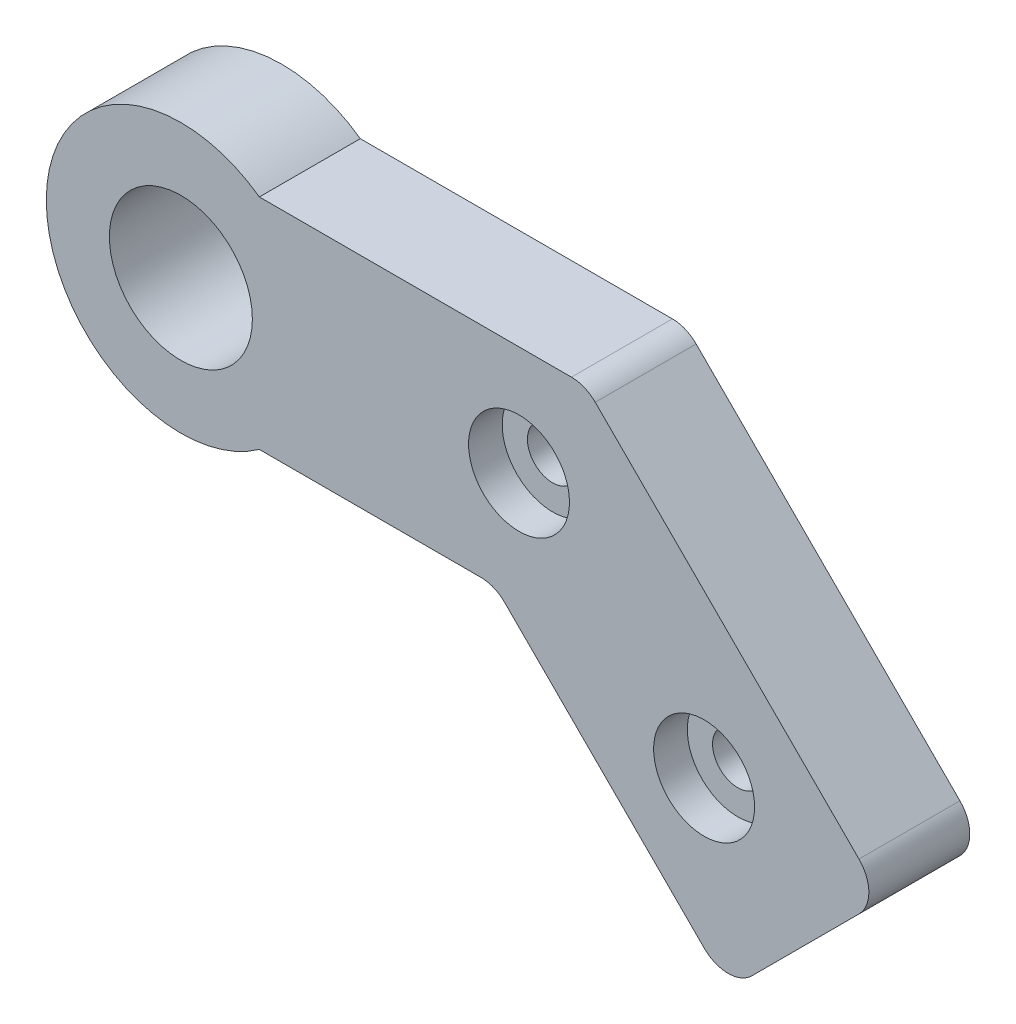
ISO-10303-21;
HEADER;
FILE_DESCRIPTION(('STEP AP214'),'2;1');
FILE_NAME('part.step','',(''),(''),'','','');
FILE_SCHEMA(('AUTOMOTIVE_DESIGN { 1 0 10303 214 1 1 1 1 }'));
ENDSEC;
DATA;
#1=APPLICATION_CONTEXT('core data for automotive mechanical design processes');
#2=APPLICATION_PROTOCOL_DEFINITION('international standard','automotive_design',2000,#1);
#3=PRODUCT_CONTEXT('',#1,'mechanical');
#4=PRODUCT('Part','Part','',(#3));
#5=PRODUCT_RELATED_PRODUCT_CATEGORY('part','',(#4));
#6=PRODUCT_DEFINITION_FORMATION('','',#4);
#7=PRODUCT_DEFINITION_CONTEXT('part definition',#1,'design');
#8=PRODUCT_DEFINITION('design','',#6,#7);
#9=PRODUCT_DEFINITION_SHAPE('','',#8);
#10=(LENGTH_UNIT() NAMED_UNIT(*) SI_UNIT(.MILLI.,.METRE.));
#11=(NAMED_UNIT(*) PLANE_ANGLE_UNIT() SI_UNIT($,.RADIAN.));
#12=(NAMED_UNIT(*) SI_UNIT($,.STERADIAN.) SOLID_ANGLE_UNIT());
#13=UNCERTAINTY_MEASURE_WITH_UNIT(LENGTH_MEASURE(1.E-05),#10,'distance_accuracy_value','');
#14=(GEOMETRIC_REPRESENTATION_CONTEXT(3) GLOBAL_UNCERTAINTY_ASSIGNED_CONTEXT((#13)) GLOBAL_UNIT_ASSIGNED_CONTEXT((#10,
#11,#12)) REPRESENTATION_CONTEXT('',''));
#15=CARTESIAN_POINT('',(0.,0.,0.));
#16=DIRECTION('',(0.,0.,1.));
#17=DIRECTION('',(1.,0.,0.));
#18=AXIS2_PLACEMENT_3D('',#15,#16,#17);
#19=CARTESIAN_POINT('',(14.2359098755599,-9.17285726228399,0.));
#20=DIRECTION('',(0.,0.,1.));
#21=DIRECTION('',(1.,0.,0.));
#22=AXIS2_PLACEMENT_3D('',#19,#20,#21);
#23=CYLINDRICAL_SURFACE('',#22,1.49999999999999);
#24=CARTESIAN_POINT('',(14.2359098755599,-9.17285726228399,0.));
#25=DIRECTION('',(0.,0.,1.));
#26=DIRECTION('',(1.,0.,0.));
#27=AXIS2_PLACEMENT_3D('',#24,#25,#26);
#28=CIRCLE('',#27,1.49999999999999);
#29=CARTESIAN_POINT('',(15.7359098755599,-9.17285726228399,0.));
#30=VERTEX_POINT('',#29);
#31=EDGE_CURVE('E177',#30,#30,#28,.T.);
#32=ORIENTED_EDGE('',*,*,#31,.F.);
#33=EDGE_LOOP('',(#32));
#34=FACE_BOUND('',#33,.T.);
#35=CARTESIAN_POINT('',(14.2359098755599,-9.17285726228399,4.));
#36=DIRECTION('',(0.,0.,1.));
#37=DIRECTION('',(1.,0.,0.));
#38=AXIS2_PLACEMENT_3D('',#35,#36,#37);
#39=CIRCLE('',#38,1.49999999999999);
#40=CARTESIAN_POINT('',(15.7359098755599,-9.17285726228399,4.));
#41=VERTEX_POINT('',#40);
#42=EDGE_CURVE('E39',#41,#41,#39,.F.);
#43=ORIENTED_EDGE('',*,*,#42,.F.);
#44=EDGE_LOOP('',(#43));
#45=FACE_BOUND('',#44,.T.);
#46=ADVANCED_FACE('F35',(#34,#45),#23,.F.);
#47=CARTESIAN_POINT('',(3.23195226079932,1.02091126621189,0.));
#48=DIRECTION('',(0.,0.,1.));
#49=DIRECTION('',(1.,0.,0.));
#50=AXIS2_PLACEMENT_3D('',#47,#48,#49);
#51=CYLINDRICAL_SURFACE('',#50,1.5);
#52=CARTESIAN_POINT('',(3.23195226079932,1.02091126621189,0.));
#53=DIRECTION('',(0.,0.,1.));
#54=DIRECTION('',(1.,0.,0.));
#55=AXIS2_PLACEMENT_3D('',#52,#53,#54);
#56=CIRCLE('',#55,1.5);
#57=CARTESIAN_POINT('',(4.73195226079932,1.02091126621189,0.));
#58=VERTEX_POINT('',#57);
#59=EDGE_CURVE('E182',#58,#58,#56,.T.);
#60=ORIENTED_EDGE('',*,*,#59,.F.);
#61=EDGE_LOOP('',(#60));
#62=FACE_BOUND('',#61,.T.);
#63=CARTESIAN_POINT('',(3.23195226079932,1.02091126621189,4.));
#64=DIRECTION('',(0.,0.,1.));
#65=DIRECTION('',(1.,0.,0.));
#66=AXIS2_PLACEMENT_3D('',#63,#64,#65);
#67=CIRCLE('',#66,1.5);
#68=CARTESIAN_POINT('',(4.73195226079932,1.02091126621189,4.));
#69=VERTEX_POINT('',#68);
#70=EDGE_CURVE('E175',#69,#69,#67,.F.);
#71=ORIENTED_EDGE('',*,*,#70,.F.);
#72=EDGE_LOOP('',(#71));
#73=FACE_BOUND('',#72,.T.);
#74=ADVANCED_FACE('F259',(#62,#73),#51,.F.);
#75=CARTESIAN_POINT('',(-16.8680476661656,1.02262474517077,6.));
#76=DIRECTION('',(0.,0.,-1.));
#77=DIRECTION('',(-1.,0.,0.));
#78=AXIS2_PLACEMENT_3D('',#75,#76,#77);
#79=CYLINDRICAL_SURFACE('',#78,7.99999999999991);
#80=CARTESIAN_POINT('',(-16.8680476661656,1.02262474517077,0.));
#81=DIRECTION('',(0.,0.,1.));
#82=DIRECTION('',(1.,0.,0.));
#83=AXIS2_PLACEMENT_3D('',#80,#81,#82);
#84=CIRCLE('',#83,7.99999999999991);
#85=CARTESIAN_POINT('',(-12.2019709104262,7.52091126621188,0.));
#86=VERTEX_POINT('',#85);
#87=CARTESIAN_POINT('',(-12.2067472212763,-5.47908873378811,0.));
#88=VERTEX_POINT('',#87);
#89=EDGE_CURVE('E140',#86,#88,#84,.T.);
#90=ORIENTED_EDGE('',*,*,#89,.T.);
#91=DIRECTION('',(0.,0.,-1.));
#92=VECTOR('',#91,1.);
#93=CARTESIAN_POINT('',(-12.2067472212763,-5.47908873378811,6.));
#94=LINE('',#93,#92);
#95=CARTESIAN_POINT('',(-12.2067472212763,-5.47908873378811,6.));
#96=VERTEX_POINT('',#95);
#97=EDGE_CURVE('E121',#96,#88,#94,.T.);
#98=ORIENTED_EDGE('',*,*,#97,.F.);
#99=CARTESIAN_POINT('',(-16.8680476661656,1.02262474517077,6.));
#100=DIRECTION('',(0.,0.,1.));
#101=DIRECTION('',(1.,0.,0.));
#102=AXIS2_PLACEMENT_3D('',#99,#100,#101);
#103=CIRCLE('',#102,7.99999999999991);
#104=CARTESIAN_POINT('',(-12.2019709104262,7.52091126621188,6.));
#105=VERTEX_POINT('',#104);
#106=EDGE_CURVE('E127',#105,#96,#103,.T.);
#107=ORIENTED_EDGE('',*,*,#106,.F.);
#108=DIRECTION('',(0.,0.,-1.));
#109=VECTOR('',#108,1.);
#110=CARTESIAN_POINT('',(-12.2019709104262,7.52091126621188,6.));
#111=LINE('',#110,#109);
#112=EDGE_CURVE('E142',#105,#86,#111,.T.);
#113=ORIENTED_EDGE('',*,*,#112,.T.);
#114=EDGE_LOOP('',(#90,#98,#107,#113));
#115=FACE_BOUND('',#114,.T.);
#116=ADVANCED_FACE('F138',(#115),#79,.T.);
#117=CARTESIAN_POINT('',(-12.2067472212763,-5.47908873378811,6.));
#118=DIRECTION('',(0.,1.,0.));
#119=DIRECTION('',(-1.,0.,0.));
#120=AXIS2_PLACEMENT_3D('',#117,#118,#119);
#121=PLANE('',#120);
#122=DIRECTION('',(1.,0.,0.));
#123=VECTOR('',#122,1.);
#124=CARTESIAN_POINT('',(-12.2067472212763,-5.47908873378811,0.));
#125=LINE('',#124,#123);
#126=CARTESIAN_POINT('',(0.964825653977482,-5.47908873378811,0.));
#127=VERTEX_POINT('',#126);
#128=EDGE_CURVE('E210',#88,#127,#125,.T.);
#129=ORIENTED_EDGE('',*,*,#128,.T.);
#130=DIRECTION('',(0.,0.,-1.));
#131=VECTOR('',#130,1.);
#132=CARTESIAN_POINT('',(0.964825653977483,-5.47908873378811,6.));
#133=LINE('',#132,#131);
#134=CARTESIAN_POINT('',(0.964825653977482,-5.47908873378811,6.));
#135=VERTEX_POINT('',#134);
#136=EDGE_CURVE('E124',#127,#135,#133,.F.);
#137=ORIENTED_EDGE('',*,*,#136,.T.);
#138=DIRECTION('',(1.,0.,0.));
#139=VECTOR('',#138,1.);
#140=CARTESIAN_POINT('',(-12.2067472212763,-5.47908873378811,6.));
#141=LINE('',#140,#139);
#142=EDGE_CURVE('E116',#96,#135,#141,.T.);
#143=ORIENTED_EDGE('',*,*,#142,.F.);
#144=ORIENTED_EDGE('',*,*,#97,.T.);
#145=EDGE_LOOP('',(#129,#137,#143,#144));
#146=FACE_BOUND('',#145,.T.);
#147=ADVANCED_FACE('F119',(#146),#121,.F.);
#148=CARTESIAN_POINT('',(1.79325277872366,-5.47908873378811,6.));
#149=DIRECTION('',(0.707106781186541,0.707106781186553,0.));
#150=DIRECTION('',(-0.707106781186554,0.707106781186542,0.));
#151=AXIS2_PLACEMENT_3D('',#148,#149,#150);
#152=PLANE('',#151);
#153=DIRECTION('',(0.707106781186554,-0.707106781186541,0.));
#154=VECTOR('',#153,1.);
#155=CARTESIAN_POINT('',(1.79325277872366,-5.47908873378811,0.));
#156=LINE('',#155,#154);
#157=CARTESIAN_POINT('',(2.37903921635057,-6.06487517141501,0.));
#158=VERTEX_POINT('',#157);
#159=CARTESIAN_POINT('',(14.2490969014395,-17.9349328565038,0.));
#160=VERTEX_POINT('',#159);
#161=EDGE_CURVE('E212',#158,#160,#156,.T.);
#162=ORIENTED_EDGE('',*,*,#161,.T.);
#163=DIRECTION('',(0.,0.,-1.));
#164=VECTOR('',#163,1.);
#165=CARTESIAN_POINT('',(14.2490969014395,-17.9349328565038,6.));
#166=LINE('',#165,#164);
#167=CARTESIAN_POINT('',(14.2490969014395,-17.9349328565038,6.));
#168=VERTEX_POINT('',#167);
#169=EDGE_CURVE('E60',#160,#168,#166,.F.);
#170=ORIENTED_EDGE('',*,*,#169,.T.);
#171=DIRECTION('',(0.707106781186554,-0.707106781186541,0.));
#172=VECTOR('',#171,1.);
#173=CARTESIAN_POINT('',(1.79325277872366,-5.47908873378811,6.));
#174=LINE('',#173,#172);
#175=CARTESIAN_POINT('',(2.37903921635057,-6.06487517141501,6.));
#176=VERTEX_POINT('',#175);
#177=EDGE_CURVE('E126',#176,#168,#174,.T.);
#178=ORIENTED_EDGE('',*,*,#177,.F.);
#179=DIRECTION('',(0.,0.,-1.));
#180=VECTOR('',#179,1.);
#181=CARTESIAN_POINT('',(2.37903921635057,-6.06487517141501,0.));
#182=LINE('',#181,#180);
#183=EDGE_CURVE('E167',#176,#158,#182,.T.);
#184=ORIENTED_EDGE('',*,*,#183,.T.);
#185=EDGE_LOOP('',(#162,#170,#178,#184));
#186=FACE_BOUND('',#185,.T.);
#187=ADVANCED_FACE('F231',(#186),#152,.F.);
#188=CARTESIAN_POINT('',(24.8556986192377,-10.1567582634517,6.));
#189=DIRECTION('',(-0.707106781186553,0.707106781186541,0.));
#190=DIRECTION('',(-0.707106781186542,-0.707106781186554,0.));
#191=AXIS2_PLACEMENT_3D('',#188,#189,#190);
#192=PLANE('',#191);
#193=DIRECTION('',(0.707106781186541,0.707106781186554,0.));
#194=VECTOR('',#193,1.);
#195=CARTESIAN_POINT('',(24.8556986192377,-10.1567582634517,0.));
#196=LINE('',#195,#194);
#197=CARTESIAN_POINT('',(17.0775240261857,-17.9349328565037,0.));
#198=VERTEX_POINT('',#197);
#199=CARTESIAN_POINT('',(23.4414850568646,-11.5709718258248,0.));
#200=VERTEX_POINT('',#199);
#201=EDGE_CURVE('E214',#198,#200,#196,.T.);
#202=ORIENTED_EDGE('',*,*,#201,.T.);
#203=DIRECTION('',(0.,0.,-1.));
#204=VECTOR('',#203,1.);
#205=CARTESIAN_POINT('',(23.4414850568646,-11.5709718258248,6.));
#206=LINE('',#205,#204);
#207=CARTESIAN_POINT('',(23.4414850568646,-11.5709718258248,6.));
#208=VERTEX_POINT('',#207);
#209=EDGE_CURVE('E160',#200,#208,#206,.F.);
#210=ORIENTED_EDGE('',*,*,#209,.T.);
#211=DIRECTION('',(0.707106781186541,0.707106781186554,0.));
#212=VECTOR('',#211,1.);
#213=CARTESIAN_POINT('',(24.8556986192377,-10.1567582634517,6.));
#214=LINE('',#213,#212);
#215=CARTESIAN_POINT('',(17.0775240261857,-17.9349328565037,6.));
#216=VERTEX_POINT('',#215);
#217=EDGE_CURVE('E204',#216,#208,#214,.T.);
#218=ORIENTED_EDGE('',*,*,#217,.F.);
#219=DIRECTION('',(0.,0.,-1.));
#220=VECTOR('',#219,1.);
#221=CARTESIAN_POINT('',(17.0775240261857,-17.9349328565037,6.));
#222=LINE('',#221,#220);
#223=EDGE_CURVE('E157',#216,#198,#222,.T.);
#224=ORIENTED_EDGE('',*,*,#223,.T.);
#225=EDGE_LOOP('',(#202,#210,#218,#224));
#226=FACE_BOUND('',#225,.T.);
#227=ADVANCED_FACE('F238',(#226),#192,.F.);
#228=CARTESIAN_POINT('',(7.17802908957383,7.52091126621189,6.));
#229=DIRECTION('',(-0.707106781186541,-0.707106781186554,0.));
#230=DIRECTION('',(0.707106781186554,-0.707106781186541,0.));
#231=AXIS2_PLACEMENT_3D('',#228,#229,#230);
#232=PLANE('',#231);
#233=DIRECTION('',(-0.707106781186554,0.707106781186541,0.));
#234=VECTOR('',#233,1.);
#235=CARTESIAN_POINT('',(7.17802908957383,7.52091126621189,6.));
#236=LINE('',#235,#234);
#237=CARTESIAN_POINT('',(23.4414850568646,-8.74254470107858,6.));
#238=VERTEX_POINT('',#237);
#239=CARTESIAN_POINT('',(7.76381552720074,6.93512482858499,6.));
#240=VERTEX_POINT('',#239);
#241=EDGE_CURVE('E206',#238,#240,#236,.T.);
#242=ORIENTED_EDGE('',*,*,#241,.F.);
#243=DIRECTION('',(0.,0.,-1.));
#244=VECTOR('',#243,1.);
#245=CARTESIAN_POINT('',(23.4414850568646,-8.74254470107857,6.));
#246=LINE('',#245,#244);
#247=CARTESIAN_POINT('',(23.4414850568646,-8.74254470107858,0.));
#248=VERTEX_POINT('',#247);
#249=EDGE_CURVE('E144',#238,#248,#246,.T.);
#250=ORIENTED_EDGE('',*,*,#249,.T.);
#251=DIRECTION('',(-0.707106781186554,0.707106781186541,0.));
#252=VECTOR('',#251,1.);
#253=CARTESIAN_POINT('',(7.17802908957383,7.52091126621189,0.));
#254=LINE('',#253,#252);
#255=CARTESIAN_POINT('',(7.76381552720074,6.93512482858499,0.));
#256=VERTEX_POINT('',#255);
#257=EDGE_CURVE('E217',#248,#256,#254,.T.);
#258=ORIENTED_EDGE('',*,*,#257,.T.);
#259=DIRECTION('',(0.,0.,-1.));
#260=VECTOR('',#259,1.);
#261=CARTESIAN_POINT('',(7.76381552720074,6.93512482858499,6.));
#262=LINE('',#261,#260);
#263=EDGE_CURVE('E141',#256,#240,#262,.F.);
#264=ORIENTED_EDGE('',*,*,#263,.T.);
#265=EDGE_LOOP('',(#242,#250,#258,#264));
#266=FACE_BOUND('',#265,.T.);
#267=ADVANCED_FACE('F246',(#266),#232,.F.);
#268=CARTESIAN_POINT('',(-12.2019709104262,7.52091126621188,6.));
#269=DIRECTION('',(0.,-1.,0.));
#270=DIRECTION('',(1.,0.,0.));
#271=AXIS2_PLACEMENT_3D('',#268,#269,#270);
#272=PLANE('',#271);
#273=DIRECTION('',(-1.,0.,0.));
#274=VECTOR('',#273,1.);
#275=CARTESIAN_POINT('',(-12.2019709104262,7.52091126621188,6.));
#276=LINE('',#275,#274);
#277=CARTESIAN_POINT('',(6.34960196482765,7.52091126621189,6.));
#278=VERTEX_POINT('',#277);
#279=EDGE_CURVE('E132',#278,#105,#276,.T.);
#280=ORIENTED_EDGE('',*,*,#279,.F.);
#281=DIRECTION('',(0.,0.,-1.));
#282=VECTOR('',#281,1.);
#283=CARTESIAN_POINT('',(6.34960196482765,7.52091126621189,6.));
#284=LINE('',#283,#282);
#285=CARTESIAN_POINT('',(6.34960196482765,7.52091126621189,0.));
#286=VERTEX_POINT('',#285);
#287=EDGE_CURVE('E172',#278,#286,#284,.T.);
#288=ORIENTED_EDGE('',*,*,#287,.T.);
#289=DIRECTION('',(-1.,0.,0.));
#290=VECTOR('',#289,1.);
#291=CARTESIAN_POINT('',(-12.2019709104262,7.52091126621188,0.));
#292=LINE('',#291,#290);
#293=EDGE_CURVE('E136',#286,#86,#292,.T.);
#294=ORIENTED_EDGE('',*,*,#293,.T.);
#295=ORIENTED_EDGE('',*,*,#112,.F.);
#296=EDGE_LOOP('',(#280,#288,#294,#295));
#297=FACE_BOUND('',#296,.T.);
#298=ADVANCED_FACE('F221',(#297),#272,.F.);
#299=CARTESIAN_POINT('',(-16.8680476661656,1.02262474517077,6.));
#300=DIRECTION('',(0.,0.,1.));
#301=DIRECTION('',(1.,0.,0.));
#302=AXIS2_PLACEMENT_3D('',#299,#300,#301);
#303=PLANE('',#302);
#304=CARTESIAN_POINT('',(14.2359098755599,-9.17285726228399,6.));
#305=DIRECTION('',(0.,0.,1.));
#306=DIRECTION('',(1.,0.,0.));
#307=AXIS2_PLACEMENT_3D('',#304,#305,#306);
#308=CIRCLE('',#307,3.);
#309=CARTESIAN_POINT('',(17.2359098755599,-9.17285726228399,6.));
#310=VERTEX_POINT('',#309);
#311=EDGE_CURVE('E192',#310,#310,#308,.T.);
#312=ORIENTED_EDGE('',*,*,#311,.F.);
#313=EDGE_LOOP('',(#312));
#314=FACE_BOUND('',#313,.T.);
#315=CARTESIAN_POINT('',(3.23195226079932,1.02091126621189,6.));
#316=DIRECTION('',(0.,0.,1.));
#317=DIRECTION('',(1.,0.,0.));
#318=AXIS2_PLACEMENT_3D('',#315,#316,#317);
#319=CIRCLE('',#318,3.);
#320=CARTESIAN_POINT('',(6.23195226079932,1.02091126621189,6.));
#321=VERTEX_POINT('',#320);
#322=EDGE_CURVE('E185',#321,#321,#319,.T.);
#323=ORIENTED_EDGE('',*,*,#322,.F.);
#324=EDGE_LOOP('',(#323));
#325=FACE_BOUND('',#324,.T.);
#326=CARTESIAN_POINT('',(-16.8680476661656,1.02262474517077,6.));
#327=DIRECTION('',(0.,0.,1.));
#328=DIRECTION('',(1.,0.,0.));
#329=AXIS2_PLACEMENT_3D('',#326,#327,#328);
#330=CIRCLE('',#329,4.25);
#331=CARTESIAN_POINT('',(-12.6180476661656,1.02262474517077,6.));
#332=VERTEX_POINT('',#331);
#333=EDGE_CURVE('E197',#332,#332,#330,.T.);
#334=ORIENTED_EDGE('',*,*,#333,.F.);
#335=EDGE_LOOP('',(#334));
#336=FACE_BOUND('',#335,.T.);
#337=ORIENTED_EDGE('',*,*,#217,.T.);
#338=CARTESIAN_POINT('',(22.0272714944915,-10.1567582634517,6.));
#339=DIRECTION('',(0.,0.,1.));
#340=DIRECTION('',(1.,0.,0.));
#341=AXIS2_PLACEMENT_3D('',#338,#339,#340);
#342=CIRCLE('',#341,2.);
#343=EDGE_CURVE('E165',#208,#238,#342,.T.);
#344=ORIENTED_EDGE('',*,*,#343,.T.);
#345=ORIENTED_EDGE('',*,*,#241,.T.);
#346=CARTESIAN_POINT('',(6.34960196482765,5.52091126621188,6.));
#347=DIRECTION('',(0.,0.,1.));
#348=DIRECTION('',(1.,0.,0.));
#349=AXIS2_PLACEMENT_3D('',#346,#347,#348);
#350=CIRCLE('',#349,2.);
#351=EDGE_CURVE('E52',#240,#278,#350,.T.);
#352=ORIENTED_EDGE('',*,*,#351,.T.);
#353=ORIENTED_EDGE('',*,*,#279,.T.);
#354=ORIENTED_EDGE('',*,*,#106,.T.);
#355=ORIENTED_EDGE('',*,*,#142,.T.);
#356=CARTESIAN_POINT('',(0.964825653977483,-7.47908873378811,6.));
#357=DIRECTION('',(0.,0.,1.));
#358=DIRECTION('',(1.,0.,0.));
#359=AXIS2_PLACEMENT_3D('',#356,#357,#358);
#360=CIRCLE('',#359,2.);
#361=EDGE_CURVE('E11',#135,#176,#360,.F.);
#362=ORIENTED_EDGE('',*,*,#361,.T.);
#363=ORIENTED_EDGE('',*,*,#177,.T.);
#364=CARTESIAN_POINT('',(15.6633104638126,-16.5207192941307,6.));
#365=DIRECTION('',(0.,0.,1.));
#366=DIRECTION('',(1.,0.,0.));
#367=AXIS2_PLACEMENT_3D('',#364,#365,#366);
#368=CIRCLE('',#367,2.);
#369=EDGE_CURVE('E163',#168,#216,#368,.T.);
#370=ORIENTED_EDGE('',*,*,#369,.T.);
#371=EDGE_LOOP('',(#337,#344,#345,#352,#353,#354,#355,#362,#363,#370));
#372=FACE_BOUND('',#371,.T.);
#373=ADVANCED_FACE('F131',(#314,#325,#336,#372),#303,.T.);
#374=CARTESIAN_POINT('',(-16.8680476661656,1.02262474517077,0.));
#375=DIRECTION('',(0.,0.,1.));
#376=DIRECTION('',(1.,0.,0.));
#377=AXIS2_PLACEMENT_3D('',#374,#375,#376);
#378=PLANE('',#377);
#379=ORIENTED_EDGE('',*,*,#31,.T.);
#380=EDGE_LOOP('',(#379));
#381=FACE_BOUND('',#380,.T.);
#382=ORIENTED_EDGE('',*,*,#59,.T.);
#383=EDGE_LOOP('',(#382));
#384=FACE_BOUND('',#383,.T.);
#385=CARTESIAN_POINT('',(-16.8680476661656,1.02262474517077,0.));
#386=DIRECTION('',(0.,0.,1.));
#387=DIRECTION('',(1.,0.,0.));
#388=AXIS2_PLACEMENT_3D('',#385,#386,#387);
#389=CIRCLE('',#388,4.25);
#390=CARTESIAN_POINT('',(-12.6180476661656,1.02262474517077,0.));
#391=VERTEX_POINT('',#390);
#392=EDGE_CURVE('E198',#391,#391,#389,.T.);
#393=ORIENTED_EDGE('',*,*,#392,.T.);
#394=EDGE_LOOP('',(#393));
#395=FACE_BOUND('',#394,.T.);
#396=ORIENTED_EDGE('',*,*,#257,.F.);
#397=CARTESIAN_POINT('',(22.0272714944915,-10.1567582634517,0.));
#398=DIRECTION('',(0.,0.,1.));
#399=DIRECTION('',(1.,0.,0.));
#400=AXIS2_PLACEMENT_3D('',#397,#398,#399);
#401=CIRCLE('',#400,2.);
#402=EDGE_CURVE('E155',#248,#200,#401,.F.);
#403=ORIENTED_EDGE('',*,*,#402,.T.);
#404=ORIENTED_EDGE('',*,*,#201,.F.);
#405=CARTESIAN_POINT('',(15.6633104638126,-16.5207192941307,0.));
#406=DIRECTION('',(0.,0.,1.));
#407=DIRECTION('',(1.,0.,0.));
#408=AXIS2_PLACEMENT_3D('',#405,#406,#407);
#409=CIRCLE('',#408,2.);
#410=EDGE_CURVE('E153',#198,#160,#409,.F.);
#411=ORIENTED_EDGE('',*,*,#410,.T.);
#412=ORIENTED_EDGE('',*,*,#161,.F.);
#413=CARTESIAN_POINT('',(0.964825653977483,-7.47908873378811,0.));
#414=DIRECTION('',(0.,0.,1.));
#415=DIRECTION('',(1.,0.,0.));
#416=AXIS2_PLACEMENT_3D('',#413,#414,#415);
#417=CIRCLE('',#416,2.);
#418=EDGE_CURVE('E44',#158,#127,#417,.T.);
#419=ORIENTED_EDGE('',*,*,#418,.T.);
#420=ORIENTED_EDGE('',*,*,#128,.F.);
#421=ORIENTED_EDGE('',*,*,#89,.F.);
#422=ORIENTED_EDGE('',*,*,#293,.F.);
#423=CARTESIAN_POINT('',(6.34960196482765,5.52091126621188,0.));
#424=DIRECTION('',(0.,0.,1.));
#425=DIRECTION('',(1.,0.,0.));
#426=AXIS2_PLACEMENT_3D('',#423,#424,#425);
#427=CIRCLE('',#426,2.);
#428=EDGE_CURVE('E151',#286,#256,#427,.F.);
#429=ORIENTED_EDGE('',*,*,#428,.T.);
#430=EDGE_LOOP('',(#396,#403,#404,#411,#412,#419,#420,#421,#422,#429));
#431=FACE_BOUND('',#430,.T.);
#432=ADVANCED_FACE('F225',(#381,#384,#395,#431),#378,.F.);
#433=CARTESIAN_POINT('',(22.0272714944915,-10.1567582634517,6.));
#434=DIRECTION('',(0.,0.,-1.));
#435=DIRECTION('',(-1.,0.,0.));
#436=AXIS2_PLACEMENT_3D('',#433,#434,#435);
#437=CYLINDRICAL_SURFACE('',#436,2.);
#438=ORIENTED_EDGE('',*,*,#343,.F.);
#439=ORIENTED_EDGE('',*,*,#209,.F.);
#440=ORIENTED_EDGE('',*,*,#402,.F.);
#441=ORIENTED_EDGE('',*,*,#249,.F.);
#442=EDGE_LOOP('',(#438,#439,#440,#441));
#443=FACE_BOUND('',#442,.T.);
#444=ADVANCED_FACE('F244',(#443),#437,.T.);
#445=CARTESIAN_POINT('',(15.6633104638126,-16.5207192941307,6.));
#446=DIRECTION('',(0.,0.,-1.));
#447=DIRECTION('',(-1.,0.,0.));
#448=AXIS2_PLACEMENT_3D('',#445,#446,#447);
#449=CYLINDRICAL_SURFACE('',#448,2.);
#450=ORIENTED_EDGE('',*,*,#369,.F.);
#451=ORIENTED_EDGE('',*,*,#169,.F.);
#452=ORIENTED_EDGE('',*,*,#410,.F.);
#453=ORIENTED_EDGE('',*,*,#223,.F.);
#454=EDGE_LOOP('',(#450,#451,#452,#453));
#455=FACE_BOUND('',#454,.T.);
#456=ADVANCED_FACE('F235',(#455),#449,.T.);
#457=CARTESIAN_POINT('',(0.964825653977483,-7.47908873378811,6.));
#458=DIRECTION('',(0.,0.,1.));
#459=DIRECTION('',(1.,0.,0.));
#460=AXIS2_PLACEMENT_3D('',#457,#458,#459);
#461=CYLINDRICAL_SURFACE('',#460,2.);
#462=ORIENTED_EDGE('',*,*,#361,.F.);
#463=ORIENTED_EDGE('',*,*,#136,.F.);
#464=ORIENTED_EDGE('',*,*,#418,.F.);
#465=ORIENTED_EDGE('',*,*,#183,.F.);
#466=EDGE_LOOP('',(#462,#463,#464,#465));
#467=FACE_BOUND('',#466,.T.);
#468=ADVANCED_FACE('F228',(#467),#461,.F.);
#469=CARTESIAN_POINT('',(6.34960196482765,5.52091126621188,6.));
#470=DIRECTION('',(0.,0.,-1.));
#471=DIRECTION('',(-1.,0.,0.));
#472=AXIS2_PLACEMENT_3D('',#469,#470,#471);
#473=CYLINDRICAL_SURFACE('',#472,2.);
#474=ORIENTED_EDGE('',*,*,#351,.F.);
#475=ORIENTED_EDGE('',*,*,#263,.F.);
#476=ORIENTED_EDGE('',*,*,#428,.F.);
#477=ORIENTED_EDGE('',*,*,#287,.F.);
#478=EDGE_LOOP('',(#474,#475,#476,#477));
#479=FACE_BOUND('',#478,.T.);
#480=ADVANCED_FACE('F37',(#479),#473,.T.);
#481=CARTESIAN_POINT('',(-16.8680476661656,1.02262474517077,0.));
#482=DIRECTION('',(0.,0.,1.));
#483=DIRECTION('',(1.,0.,0.));
#484=AXIS2_PLACEMENT_3D('',#481,#482,#483);
#485=CYLINDRICAL_SURFACE('',#484,4.25);
#486=ORIENTED_EDGE('',*,*,#392,.F.);
#487=EDGE_LOOP('',(#486));
#488=FACE_BOUND('',#487,.T.);
#489=ORIENTED_EDGE('',*,*,#333,.T.);
#490=EDGE_LOOP('',(#489));
#491=FACE_BOUND('',#490,.T.);
#492=ADVANCED_FACE('F250',(#488,#491),#485,.F.);
#493=CARTESIAN_POINT('',(3.23195226079932,1.02091126621189,4.));
#494=DIRECTION('',(0.,0.,1.));
#495=DIRECTION('',(1.,0.,0.));
#496=AXIS2_PLACEMENT_3D('',#493,#494,#495);
#497=PLANE('',#496);
#498=CARTESIAN_POINT('',(3.23195226079932,1.02091126621189,4.));
#499=DIRECTION('',(0.,0.,1.));
#500=DIRECTION('',(1.,0.,0.));
#501=AXIS2_PLACEMENT_3D('',#498,#499,#500);
#502=CIRCLE('',#501,3.);
#503=CARTESIAN_POINT('',(6.23195226079932,1.02091126621189,4.));
#504=VERTEX_POINT('',#503);
#505=EDGE_CURVE('E178',#504,#504,#502,.T.);
#506=ORIENTED_EDGE('',*,*,#505,.T.);
#507=EDGE_LOOP('',(#506));
#508=FACE_BOUND('',#507,.T.);
#509=ORIENTED_EDGE('',*,*,#70,.T.);
#510=EDGE_LOOP('',(#509));
#511=FACE_BOUND('',#510,.T.);
#512=ADVANCED_FACE('F255',(#508,#511),#497,.T.);
#513=CARTESIAN_POINT('',(3.23195226079932,1.02091126621189,4.));
#514=DIRECTION('',(0.,0.,1.));
#515=DIRECTION('',(1.,0.,0.));
#516=AXIS2_PLACEMENT_3D('',#513,#514,#515);
#517=CYLINDRICAL_SURFACE('',#516,3.);
#518=ORIENTED_EDGE('',*,*,#505,.F.);
#519=EDGE_LOOP('',(#518));
#520=FACE_BOUND('',#519,.T.);
#521=ORIENTED_EDGE('',*,*,#322,.T.);
#522=EDGE_LOOP('',(#521));
#523=FACE_BOUND('',#522,.T.);
#524=ADVANCED_FACE('F270',(#520,#523),#517,.F.);
#525=CARTESIAN_POINT('',(14.2359098755599,-9.17285726228399,4.));
#526=DIRECTION('',(0.,0.,1.));
#527=DIRECTION('',(1.,0.,0.));
#528=AXIS2_PLACEMENT_3D('',#525,#526,#527);
#529=PLANE('',#528);
#530=CARTESIAN_POINT('',(14.2359098755599,-9.17285726228399,4.));
#531=DIRECTION('',(0.,0.,1.));
#532=DIRECTION('',(1.,0.,0.));
#533=AXIS2_PLACEMENT_3D('',#530,#531,#532);
#534=CIRCLE('',#533,3.);
#535=CARTESIAN_POINT('',(17.2359098755599,-9.17285726228399,4.));
#536=VERTEX_POINT('',#535);
#537=EDGE_CURVE('E378',#536,#536,#534,.T.);
#538=ORIENTED_EDGE('',*,*,#537,.T.);
#539=EDGE_LOOP('',(#538));
#540=FACE_BOUND('',#539,.T.);
#541=ORIENTED_EDGE('',*,*,#42,.T.);
#542=EDGE_LOOP('',(#541));
#543=FACE_BOUND('',#542,.T.);
#544=ADVANCED_FACE('F352',(#540,#543),#529,.T.);
#545=CARTESIAN_POINT('',(14.2359098755599,-9.17285726228399,4.));
#546=DIRECTION('',(0.,0.,1.));
#547=DIRECTION('',(1.,0.,0.));
#548=AXIS2_PLACEMENT_3D('',#545,#546,#547);
#549=CYLINDRICAL_SURFACE('',#548,3.);
#550=ORIENTED_EDGE('',*,*,#537,.F.);
#551=EDGE_LOOP('',(#550));
#552=FACE_BOUND('',#551,.T.);
#553=ORIENTED_EDGE('',*,*,#311,.T.);
#554=EDGE_LOOP('',(#553));
#555=FACE_BOUND('',#554,.T.);
#556=ADVANCED_FACE('F361',(#552,#555),#549,.F.);
#557=CLOSED_SHELL('',(#46,#74,#116,#147,#187,#227,#267,#298,#373,#432,#444,#456,#468,#480,#492,
#512,#524,#544,#556));
#558=MANIFOLD_SOLID_BREP('B2',#557);
#559=ADVANCED_BREP_SHAPE_REPRESENTATION('',(#18,#558),#14);
#560=SHAPE_DEFINITION_REPRESENTATION(#9,#559);
ENDSEC;
END-ISO-10303-21;
